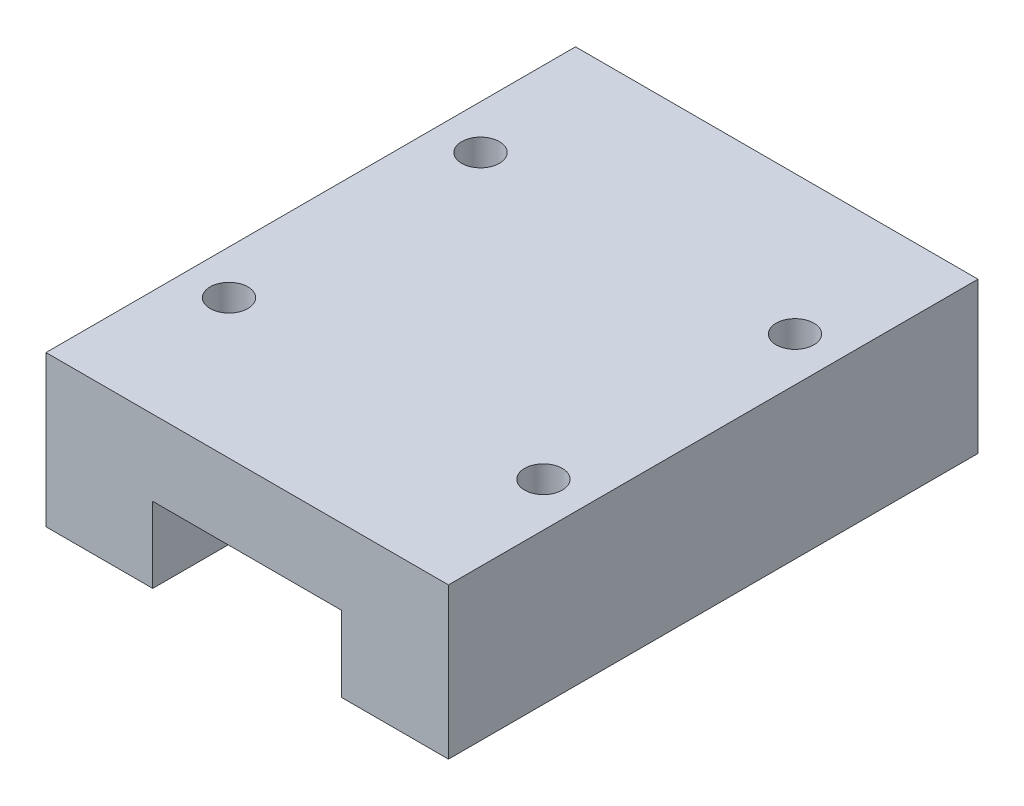
ISO-10303-21;
HEADER;
FILE_DESCRIPTION(('STEP AP214'),'2;1');
FILE_NAME('part.step','',(''),(''),'','','');
FILE_SCHEMA(('AUTOMOTIVE_DESIGN { 1 0 10303 214 1 1 1 1 }'));
ENDSEC;
DATA;
#1=APPLICATION_CONTEXT('core data for automotive mechanical design processes');
#2=APPLICATION_PROTOCOL_DEFINITION('international standard','automotive_design',2000,#1);
#3=PRODUCT_CONTEXT('',#1,'mechanical');
#4=PRODUCT('Part','Part','',(#3));
#5=PRODUCT_RELATED_PRODUCT_CATEGORY('part','',(#4));
#6=PRODUCT_DEFINITION_FORMATION('','',#4);
#7=PRODUCT_DEFINITION_CONTEXT('part definition',#1,'design');
#8=PRODUCT_DEFINITION('design','',#6,#7);
#9=PRODUCT_DEFINITION_SHAPE('','',#8);
#10=(LENGTH_UNIT() NAMED_UNIT(*) SI_UNIT(.MILLI.,.METRE.));
#11=(NAMED_UNIT(*) PLANE_ANGLE_UNIT() SI_UNIT($,.RADIAN.));
#12=(NAMED_UNIT(*) SI_UNIT($,.STERADIAN.) SOLID_ANGLE_UNIT());
#13=UNCERTAINTY_MEASURE_WITH_UNIT(LENGTH_MEASURE(1.E-05),#10,'distance_accuracy_value','');
#14=(GEOMETRIC_REPRESENTATION_CONTEXT(3) GLOBAL_UNCERTAINTY_ASSIGNED_CONTEXT((#13)) GLOBAL_UNIT_ASSIGNED_CONTEXT((#10,
#11,#12)) REPRESENTATION_CONTEXT('',''));
#15=CARTESIAN_POINT('',(0.,0.,0.));
#16=DIRECTION('',(0.,0.,1.));
#17=DIRECTION('',(1.,0.,0.));
#18=AXIS2_PLACEMENT_3D('',#15,#16,#17);
#19=CARTESIAN_POINT('',(16.,-6.,21.05));
#20=DIRECTION('',(0.,1.,0.));
#21=DIRECTION('',(-1.,0.,0.));
#22=AXIS2_PLACEMENT_3D('',#19,#20,#21);
#23=PLANE('',#22);
#24=DIRECTION('',(1.,0.,0.));
#25=VECTOR('',#24,1.);
#26=CARTESIAN_POINT('',(16.,-6.,-21.05));
#27=LINE('',#26,#25);
#28=CARTESIAN_POINT('',(-16.,-6.,-21.05));
#29=VERTEX_POINT('',#28);
#30=CARTESIAN_POINT('',(-7.51414045333831,-6.00000000000011,-21.05));
#31=VERTEX_POINT('',#30);
#32=EDGE_CURVE('E119',#29,#31,#27,.T.);
#33=ORIENTED_EDGE('',*,*,#32,.T.);
#34=DIRECTION('',(0.,0.,1.));
#35=VECTOR('',#34,1.);
#36=CARTESIAN_POINT('',(-7.51414045333831,-6.00000000000011,-21.05));
#37=LINE('',#36,#35);
#38=CARTESIAN_POINT('',(-7.51414045333831,-6.00000000000011,21.05));
#39=VERTEX_POINT('',#38);
#40=EDGE_CURVE('E107',#31,#39,#37,.T.);
#41=ORIENTED_EDGE('',*,*,#40,.T.);
#42=DIRECTION('',(1.,0.,0.));
#43=VECTOR('',#42,1.);
#44=CARTESIAN_POINT('',(16.,-6.,21.05));
#45=LINE('',#44,#43);
#46=CARTESIAN_POINT('',(-16.,-6.,21.05));
#47=VERTEX_POINT('',#46);
#48=EDGE_CURVE('E85',#47,#39,#45,.T.);
#49=ORIENTED_EDGE('',*,*,#48,.F.);
#50=DIRECTION('',(0.,0.,-1.));
#51=VECTOR('',#50,1.);
#52=CARTESIAN_POINT('',(-16.,-6.,21.05));
#53=LINE('',#52,#51);
#54=EDGE_CURVE('E11',#47,#29,#53,.T.);
#55=ORIENTED_EDGE('',*,*,#54,.T.);
#56=EDGE_LOOP('',(#33,#41,#49,#55));
#57=FACE_BOUND('',#56,.T.);
#58=ADVANCED_FACE('F33',(#57),#23,.F.);
#59=CARTESIAN_POINT('',(-16.,-6.,21.05));
#60=DIRECTION('',(1.,0.,0.));
#61=DIRECTION('',(0.,0.,-1.));
#62=AXIS2_PLACEMENT_3D('',#59,#60,#61);
#63=PLANE('',#62);
#64=DIRECTION('',(0.,-1.,0.));
#65=VECTOR('',#64,1.);
#66=CARTESIAN_POINT('',(-16.,-6.,-21.05));
#67=LINE('',#66,#65);
#68=CARTESIAN_POINT('',(-16.,6.,-21.05));
#69=VERTEX_POINT('',#68);
#70=EDGE_CURVE('E130',#69,#29,#67,.T.);
#71=ORIENTED_EDGE('',*,*,#70,.T.);
#72=ORIENTED_EDGE('',*,*,#54,.F.);
#73=DIRECTION('',(0.,-1.,0.));
#74=VECTOR('',#73,1.);
#75=CARTESIAN_POINT('',(-16.,-6.,21.05));
#76=LINE('',#75,#74);
#77=CARTESIAN_POINT('',(-16.,6.,21.05));
#78=VERTEX_POINT('',#77);
#79=EDGE_CURVE('E135',#78,#47,#76,.T.);
#80=ORIENTED_EDGE('',*,*,#79,.F.);
#81=DIRECTION('',(0.,0.,-1.));
#82=VECTOR('',#81,1.);
#83=CARTESIAN_POINT('',(-16.,6.,21.05));
#84=LINE('',#83,#82);
#85=EDGE_CURVE('E136',#78,#69,#84,.T.);
#86=ORIENTED_EDGE('',*,*,#85,.T.);
#87=EDGE_LOOP('',(#71,#72,#80,#86));
#88=FACE_BOUND('',#87,.T.);
#89=ADVANCED_FACE('F35',(#88),#63,.F.);
#90=CARTESIAN_POINT('',(7.5,-6.00000000000011,21.05));
#91=VERTEX_POINT('',#90);
#92=CARTESIAN_POINT('',(16.,-6.,21.05));
#93=VERTEX_POINT('',#92);
#94=EDGE_CURVE('E161',#91,#93,#45,.T.);
#95=ORIENTED_EDGE('',*,*,#94,.F.);
#96=DIRECTION('',(0.,0.,1.));
#97=VECTOR('',#96,1.);
#98=CARTESIAN_POINT('',(7.5,-6.00000000000011,-21.05));
#99=LINE('',#98,#97);
#100=CARTESIAN_POINT('',(7.5,-6.00000000000011,-21.05));
#101=VERTEX_POINT('',#100);
#102=EDGE_CURVE('E114',#101,#91,#99,.T.);
#103=ORIENTED_EDGE('',*,*,#102,.F.);
#104=CARTESIAN_POINT('',(16.,-6.,-21.05));
#105=VERTEX_POINT('',#104);
#106=EDGE_CURVE('E127',#101,#105,#27,.T.);
#107=ORIENTED_EDGE('',*,*,#106,.T.);
#108=DIRECTION('',(0.,0.,-1.));
#109=VECTOR('',#108,1.);
#110=CARTESIAN_POINT('',(16.,-6.,21.05));
#111=LINE('',#110,#109);
#112=EDGE_CURVE('E41',#93,#105,#111,.T.);
#113=ORIENTED_EDGE('',*,*,#112,.F.);
#114=EDGE_LOOP('',(#95,#103,#107,#113));
#115=FACE_BOUND('',#114,.T.);
#116=ADVANCED_FACE('F236',(#115),#23,.F.);
#117=CARTESIAN_POINT('',(16.,-6.,21.05));
#118=DIRECTION('',(-1.,0.,0.));
#119=DIRECTION('',(0.,0.,1.));
#120=AXIS2_PLACEMENT_3D('',#117,#118,#119);
#121=PLANE('',#120);
#122=DIRECTION('',(0.,1.,0.));
#123=VECTOR('',#122,1.);
#124=CARTESIAN_POINT('',(16.,-6.,-21.05));
#125=LINE('',#124,#123);
#126=CARTESIAN_POINT('',(16.,6.,-21.05));
#127=VERTEX_POINT('',#126);
#128=EDGE_CURVE('E126',#105,#127,#125,.T.);
#129=ORIENTED_EDGE('',*,*,#128,.T.);
#130=DIRECTION('',(0.,0.,-1.));
#131=VECTOR('',#130,1.);
#132=CARTESIAN_POINT('',(16.,6.,21.05));
#133=LINE('',#132,#131);
#134=CARTESIAN_POINT('',(16.,6.,21.05));
#135=VERTEX_POINT('',#134);
#136=EDGE_CURVE('E138',#135,#127,#133,.T.);
#137=ORIENTED_EDGE('',*,*,#136,.F.);
#138=DIRECTION('',(0.,1.,0.));
#139=VECTOR('',#138,1.);
#140=CARTESIAN_POINT('',(16.,-6.,21.05));
#141=LINE('',#140,#139);
#142=EDGE_CURVE('E146',#93,#135,#141,.T.);
#143=ORIENTED_EDGE('',*,*,#142,.F.);
#144=ORIENTED_EDGE('',*,*,#112,.T.);
#145=EDGE_LOOP('',(#129,#137,#143,#144));
#146=FACE_BOUND('',#145,.T.);
#147=ADVANCED_FACE('F144',(#146),#121,.F.);
#148=CARTESIAN_POINT('',(16.,6.,21.05));
#149=DIRECTION('',(0.,-1.,0.));
#150=DIRECTION('',(1.,0.,0.));
#151=AXIS2_PLACEMENT_3D('',#148,#149,#150);
#152=PLANE('',#151);
#153=CARTESIAN_POINT('',(-12.5,6.,10.));
#154=DIRECTION('',(0.,1.,0.));
#155=DIRECTION('',(-1.,0.,0.));
#156=AXIS2_PLACEMENT_3D('',#153,#154,#155);
#157=CIRCLE('',#156,1.5);
#158=CARTESIAN_POINT('',(-14.,6.,10.));
#159=VERTEX_POINT('',#158);
#160=EDGE_CURVE('E193',#159,#159,#157,.T.);
#161=ORIENTED_EDGE('',*,*,#160,.F.);
#162=EDGE_LOOP('',(#161));
#163=FACE_BOUND('',#162,.T.);
#164=CARTESIAN_POINT('',(12.5,6.,10.));
#165=DIRECTION('',(0.,1.,0.));
#166=DIRECTION('',(-1.,0.,0.));
#167=AXIS2_PLACEMENT_3D('',#164,#165,#166);
#168=CIRCLE('',#167,1.5);
#169=CARTESIAN_POINT('',(11.,6.,10.));
#170=VERTEX_POINT('',#169);
#171=EDGE_CURVE('E187',#170,#170,#168,.T.);
#172=ORIENTED_EDGE('',*,*,#171,.F.);
#173=EDGE_LOOP('',(#172));
#174=FACE_BOUND('',#173,.T.);
#175=CARTESIAN_POINT('',(12.5,6.,-10.));
#176=DIRECTION('',(0.,1.,0.));
#177=DIRECTION('',(-1.,0.,0.));
#178=AXIS2_PLACEMENT_3D('',#175,#176,#177);
#179=CIRCLE('',#178,1.5);
#180=CARTESIAN_POINT('',(11.,6.,-10.));
#181=VERTEX_POINT('',#180);
#182=EDGE_CURVE('E181',#181,#181,#179,.T.);
#183=ORIENTED_EDGE('',*,*,#182,.F.);
#184=EDGE_LOOP('',(#183));
#185=FACE_BOUND('',#184,.T.);
#186=CARTESIAN_POINT('',(-12.5,6.,-10.));
#187=DIRECTION('',(0.,1.,0.));
#188=DIRECTION('',(-1.,0.,0.));
#189=AXIS2_PLACEMENT_3D('',#186,#187,#188);
#190=CIRCLE('',#189,1.5);
#191=CARTESIAN_POINT('',(-14.,6.,-10.));
#192=VERTEX_POINT('',#191);
#193=EDGE_CURVE('E173',#192,#192,#190,.T.);
#194=ORIENTED_EDGE('',*,*,#193,.F.);
#195=EDGE_LOOP('',(#194));
#196=FACE_BOUND('',#195,.T.);
#197=DIRECTION('',(-1.,0.,0.));
#198=VECTOR('',#197,1.);
#199=CARTESIAN_POINT('',(16.,6.,-21.05));
#200=LINE('',#199,#198);
#201=EDGE_CURVE('E78',#127,#69,#200,.T.);
#202=ORIENTED_EDGE('',*,*,#201,.T.);
#203=ORIENTED_EDGE('',*,*,#85,.F.);
#204=DIRECTION('',(-1.,0.,0.));
#205=VECTOR('',#204,1.);
#206=CARTESIAN_POINT('',(16.,6.,21.05));
#207=LINE('',#206,#205);
#208=EDGE_CURVE('E57',#135,#78,#207,.T.);
#209=ORIENTED_EDGE('',*,*,#208,.F.);
#210=ORIENTED_EDGE('',*,*,#136,.T.);
#211=EDGE_LOOP('',(#202,#203,#209,#210));
#212=FACE_BOUND('',#211,.T.);
#213=ADVANCED_FACE('F165',(#163,#174,#185,#196,#212),#152,.F.);
#214=CARTESIAN_POINT('',(0.,0.,21.05));
#215=DIRECTION('',(0.,0.,1.));
#216=DIRECTION('',(1.,0.,0.));
#217=AXIS2_PLACEMENT_3D('',#214,#215,#216);
#218=PLANE('',#217);
#219=DIRECTION('',(0.,-1.,0.));
#220=VECTOR('',#219,1.);
#221=CARTESIAN_POINT('',(-7.51414045333831,0.,21.05));
#222=LINE('',#221,#220);
#223=CARTESIAN_POINT('',(-7.51414045333831,0.,21.05));
#224=VERTEX_POINT('',#223);
#225=EDGE_CURVE('E112',#224,#39,#222,.T.);
#226=ORIENTED_EDGE('',*,*,#225,.F.);
#227=DIRECTION('',(-1.,0.,0.));
#228=VECTOR('',#227,1.);
#229=CARTESIAN_POINT('',(-7.51414045333831,0.,21.05));
#230=LINE('',#229,#228);
#231=CARTESIAN_POINT('',(7.5,0.,21.05));
#232=VERTEX_POINT('',#231);
#233=EDGE_CURVE('E122',#232,#224,#230,.T.);
#234=ORIENTED_EDGE('',*,*,#233,.F.);
#235=DIRECTION('',(0.,1.,0.));
#236=VECTOR('',#235,1.);
#237=CARTESIAN_POINT('',(7.5,0.,21.05));
#238=LINE('',#237,#236);
#239=EDGE_CURVE('E168',#91,#232,#238,.T.);
#240=ORIENTED_EDGE('',*,*,#239,.F.);
#241=ORIENTED_EDGE('',*,*,#94,.T.);
#242=ORIENTED_EDGE('',*,*,#142,.T.);
#243=ORIENTED_EDGE('',*,*,#208,.T.);
#244=ORIENTED_EDGE('',*,*,#79,.T.);
#245=ORIENTED_EDGE('',*,*,#48,.T.);
#246=EDGE_LOOP('',(#226,#234,#240,#241,#242,#243,#244,#245));
#247=FACE_BOUND('',#246,.T.);
#248=ADVANCED_FACE('F163',(#247),#218,.T.);
#249=CARTESIAN_POINT('',(0.,0.,-21.05));
#250=DIRECTION('',(0.,0.,1.));
#251=DIRECTION('',(1.,0.,0.));
#252=AXIS2_PLACEMENT_3D('',#249,#250,#251);
#253=PLANE('',#252);
#254=DIRECTION('',(-1.,0.,0.));
#255=VECTOR('',#254,1.);
#256=CARTESIAN_POINT('',(-7.51414045333831,0.,-21.05));
#257=LINE('',#256,#255);
#258=CARTESIAN_POINT('',(7.5,0.,-21.05));
#259=VERTEX_POINT('',#258);
#260=CARTESIAN_POINT('',(-7.51414045333831,0.,-21.05));
#261=VERTEX_POINT('',#260);
#262=EDGE_CURVE('E48',#259,#261,#257,.T.);
#263=ORIENTED_EDGE('',*,*,#262,.T.);
#264=DIRECTION('',(0.,-1.,0.));
#265=VECTOR('',#264,1.);
#266=CARTESIAN_POINT('',(-7.51414045333831,0.,-21.05));
#267=LINE('',#266,#265);
#268=EDGE_CURVE('E110',#261,#31,#267,.T.);
#269=ORIENTED_EDGE('',*,*,#268,.T.);
#270=ORIENTED_EDGE('',*,*,#32,.F.);
#271=ORIENTED_EDGE('',*,*,#70,.F.);
#272=ORIENTED_EDGE('',*,*,#201,.F.);
#273=ORIENTED_EDGE('',*,*,#128,.F.);
#274=ORIENTED_EDGE('',*,*,#106,.F.);
#275=DIRECTION('',(0.,1.,0.));
#276=VECTOR('',#275,1.);
#277=CARTESIAN_POINT('',(7.5,0.,-21.05));
#278=LINE('',#277,#276);
#279=EDGE_CURVE('E121',#101,#259,#278,.T.);
#280=ORIENTED_EDGE('',*,*,#279,.T.);
#281=EDGE_LOOP('',(#263,#269,#270,#271,#272,#273,#274,#280));
#282=FACE_BOUND('',#281,.T.);
#283=ADVANCED_FACE('F117',(#282),#253,.F.);
#284=CARTESIAN_POINT('',(-7.51414045333831,0.,-21.05));
#285=DIRECTION('',(-1.,0.,0.));
#286=DIRECTION('',(0.,0.,1.));
#287=AXIS2_PLACEMENT_3D('',#284,#285,#286);
#288=PLANE('',#287);
#289=ORIENTED_EDGE('',*,*,#225,.T.);
#290=ORIENTED_EDGE('',*,*,#40,.F.);
#291=ORIENTED_EDGE('',*,*,#268,.F.);
#292=DIRECTION('',(0.,0.,1.));
#293=VECTOR('',#292,1.);
#294=CARTESIAN_POINT('',(-7.51414045333831,0.,-21.05));
#295=LINE('',#294,#293);
#296=EDGE_CURVE('E151',#261,#224,#295,.T.);
#297=ORIENTED_EDGE('',*,*,#296,.T.);
#298=EDGE_LOOP('',(#289,#290,#291,#297));
#299=FACE_BOUND('',#298,.T.);
#300=ADVANCED_FACE('F109',(#299),#288,.F.);
#301=CARTESIAN_POINT('',(-7.51414045333831,0.,-21.05));
#302=DIRECTION('',(0.,1.,0.));
#303=DIRECTION('',(0.,0.,1.));
#304=AXIS2_PLACEMENT_3D('',#301,#302,#303);
#305=PLANE('',#304);
#306=ORIENTED_EDGE('',*,*,#233,.T.);
#307=ORIENTED_EDGE('',*,*,#296,.F.);
#308=ORIENTED_EDGE('',*,*,#262,.F.);
#309=DIRECTION('',(0.,0.,1.));
#310=VECTOR('',#309,1.);
#311=CARTESIAN_POINT('',(7.5,0.,-21.05));
#312=LINE('',#311,#310);
#313=EDGE_CURVE('E152',#259,#232,#312,.T.);
#314=ORIENTED_EDGE('',*,*,#313,.T.);
#315=EDGE_LOOP('',(#306,#307,#308,#314));
#316=FACE_BOUND('',#315,.T.);
#317=ADVANCED_FACE('F230',(#316),#305,.F.);
#318=CARTESIAN_POINT('',(7.5,0.,-21.05));
#319=DIRECTION('',(1.,0.,0.));
#320=DIRECTION('',(0.,0.,-1.));
#321=AXIS2_PLACEMENT_3D('',#318,#319,#320);
#322=PLANE('',#321);
#323=ORIENTED_EDGE('',*,*,#239,.T.);
#324=ORIENTED_EDGE('',*,*,#313,.F.);
#325=ORIENTED_EDGE('',*,*,#279,.F.);
#326=ORIENTED_EDGE('',*,*,#102,.T.);
#327=EDGE_LOOP('',(#323,#324,#325,#326));
#328=FACE_BOUND('',#327,.T.);
#329=ADVANCED_FACE('F220',(#328),#322,.F.);
#330=CARTESIAN_POINT('',(-12.5,0.,-10.));
#331=DIRECTION('',(0.,1.,0.));
#332=DIRECTION('',(-1.,0.,0.));
#333=AXIS2_PLACEMENT_3D('',#330,#331,#332);
#334=CYLINDRICAL_SURFACE('',#333,1.5);
#335=CARTESIAN_POINT('',(-12.5,0.,-10.));
#336=DIRECTION('',(0.,1.,0.));
#337=DIRECTION('',(-1.,0.,0.));
#338=AXIS2_PLACEMENT_3D('',#335,#336,#337);
#339=CIRCLE('',#338,1.5);
#340=CARTESIAN_POINT('',(-14.,0.,-10.));
#341=VERTEX_POINT('',#340);
#342=EDGE_CURVE('E169',#341,#341,#339,.T.);
#343=ORIENTED_EDGE('',*,*,#342,.F.);
#344=EDGE_LOOP('',(#343));
#345=FACE_BOUND('',#344,.T.);
#346=ORIENTED_EDGE('',*,*,#193,.T.);
#347=EDGE_LOOP('',(#346));
#348=FACE_BOUND('',#347,.T.);
#349=ADVANCED_FACE('F217',(#345,#348),#334,.F.);
#350=CARTESIAN_POINT('',(-12.5,0.,-10.));
#351=DIRECTION('',(0.,1.,0.));
#352=DIRECTION('',(-1.,0.,0.));
#353=AXIS2_PLACEMENT_3D('',#350,#351,#352);
#354=PLANE('',#353);
#355=ORIENTED_EDGE('',*,*,#342,.T.);
#356=EDGE_LOOP('',(#355));
#357=FACE_BOUND('',#356,.T.);
#358=ADVANCED_FACE('F219',(#357),#354,.T.);
#359=CARTESIAN_POINT('',(12.5,0.,-10.));
#360=DIRECTION('',(0.,1.,0.));
#361=DIRECTION('',(-1.,0.,0.));
#362=AXIS2_PLACEMENT_3D('',#359,#360,#361);
#363=CYLINDRICAL_SURFACE('',#362,1.5);
#364=CARTESIAN_POINT('',(12.5,0.,-10.));
#365=DIRECTION('',(0.,1.,0.));
#366=DIRECTION('',(-1.,0.,0.));
#367=AXIS2_PLACEMENT_3D('',#364,#365,#366);
#368=CIRCLE('',#367,1.5);
#369=CARTESIAN_POINT('',(11.,0.,-10.));
#370=VERTEX_POINT('',#369);
#371=EDGE_CURVE('E179',#370,#370,#368,.T.);
#372=ORIENTED_EDGE('',*,*,#371,.F.);
#373=EDGE_LOOP('',(#372));
#374=FACE_BOUND('',#373,.T.);
#375=ORIENTED_EDGE('',*,*,#182,.T.);
#376=EDGE_LOOP('',(#375));
#377=FACE_BOUND('',#376,.T.);
#378=ADVANCED_FACE('F227',(#374,#377),#363,.F.);
#379=CARTESIAN_POINT('',(12.5,0.,-10.));
#380=DIRECTION('',(0.,1.,0.));
#381=DIRECTION('',(-1.,0.,0.));
#382=AXIS2_PLACEMENT_3D('',#379,#380,#381);
#383=PLANE('',#382);
#384=ORIENTED_EDGE('',*,*,#371,.T.);
#385=EDGE_LOOP('',(#384));
#386=FACE_BOUND('',#385,.T.);
#387=ADVANCED_FACE('F301',(#386),#383,.T.);
#388=CARTESIAN_POINT('',(12.5,0.,10.));
#389=DIRECTION('',(0.,1.,0.));
#390=DIRECTION('',(-1.,0.,0.));
#391=AXIS2_PLACEMENT_3D('',#388,#389,#390);
#392=CYLINDRICAL_SURFACE('',#391,1.5);
#393=CARTESIAN_POINT('',(12.5,0.,10.));
#394=DIRECTION('',(0.,1.,0.));
#395=DIRECTION('',(-1.,0.,0.));
#396=AXIS2_PLACEMENT_3D('',#393,#394,#395);
#397=CIRCLE('',#396,1.5);
#398=CARTESIAN_POINT('',(11.,0.,10.));
#399=VERTEX_POINT('',#398);
#400=EDGE_CURVE('E184',#399,#399,#397,.T.);
#401=ORIENTED_EDGE('',*,*,#400,.F.);
#402=EDGE_LOOP('',(#401));
#403=FACE_BOUND('',#402,.T.);
#404=ORIENTED_EDGE('',*,*,#171,.T.);
#405=EDGE_LOOP('',(#404));
#406=FACE_BOUND('',#405,.T.);
#407=ADVANCED_FACE('F311',(#403,#406),#392,.F.);
#408=CARTESIAN_POINT('',(12.5,0.,10.));
#409=DIRECTION('',(0.,1.,0.));
#410=DIRECTION('',(-1.,0.,0.));
#411=AXIS2_PLACEMENT_3D('',#408,#409,#410);
#412=PLANE('',#411);
#413=ORIENTED_EDGE('',*,*,#400,.T.);
#414=EDGE_LOOP('',(#413));
#415=FACE_BOUND('',#414,.T.);
#416=ADVANCED_FACE('F204',(#415),#412,.T.);
#417=CARTESIAN_POINT('',(-12.5,0.,10.));
#418=DIRECTION('',(0.,1.,0.));
#419=DIRECTION('',(-1.,0.,0.));
#420=AXIS2_PLACEMENT_3D('',#417,#418,#419);
#421=CYLINDRICAL_SURFACE('',#420,1.5);
#422=CARTESIAN_POINT('',(-12.5,0.,10.));
#423=DIRECTION('',(0.,1.,0.));
#424=DIRECTION('',(-1.,0.,0.));
#425=AXIS2_PLACEMENT_3D('',#422,#423,#424);
#426=CIRCLE('',#425,1.5);
#427=CARTESIAN_POINT('',(-14.,0.,10.));
#428=VERTEX_POINT('',#427);
#429=EDGE_CURVE('E190',#428,#428,#426,.T.);
#430=ORIENTED_EDGE('',*,*,#429,.F.);
#431=EDGE_LOOP('',(#430));
#432=FACE_BOUND('',#431,.T.);
#433=ORIENTED_EDGE('',*,*,#160,.T.);
#434=EDGE_LOOP('',(#433));
#435=FACE_BOUND('',#434,.T.);
#436=ADVANCED_FACE('F201',(#432,#435),#421,.F.);
#437=CARTESIAN_POINT('',(-12.5,0.,10.));
#438=DIRECTION('',(0.,1.,0.));
#439=DIRECTION('',(-1.,0.,0.));
#440=AXIS2_PLACEMENT_3D('',#437,#438,#439);
#441=PLANE('',#440);
#442=ORIENTED_EDGE('',*,*,#429,.T.);
#443=EDGE_LOOP('',(#442));
#444=FACE_BOUND('',#443,.T.);
#445=ADVANCED_FACE('F199',(#444),#441,.T.);
#446=CLOSED_SHELL('',(#58,#89,#116,#147,#213,#248,#283,#300,#317,#329,#349,#358,#378,#387,#407,
#416,#436,#445));
#447=MANIFOLD_SOLID_BREP('B2',#446);
#448=ADVANCED_BREP_SHAPE_REPRESENTATION('',(#18,#447),#14);
#449=SHAPE_DEFINITION_REPRESENTATION(#9,#448);
ENDSEC;
END-ISO-10303-21;
